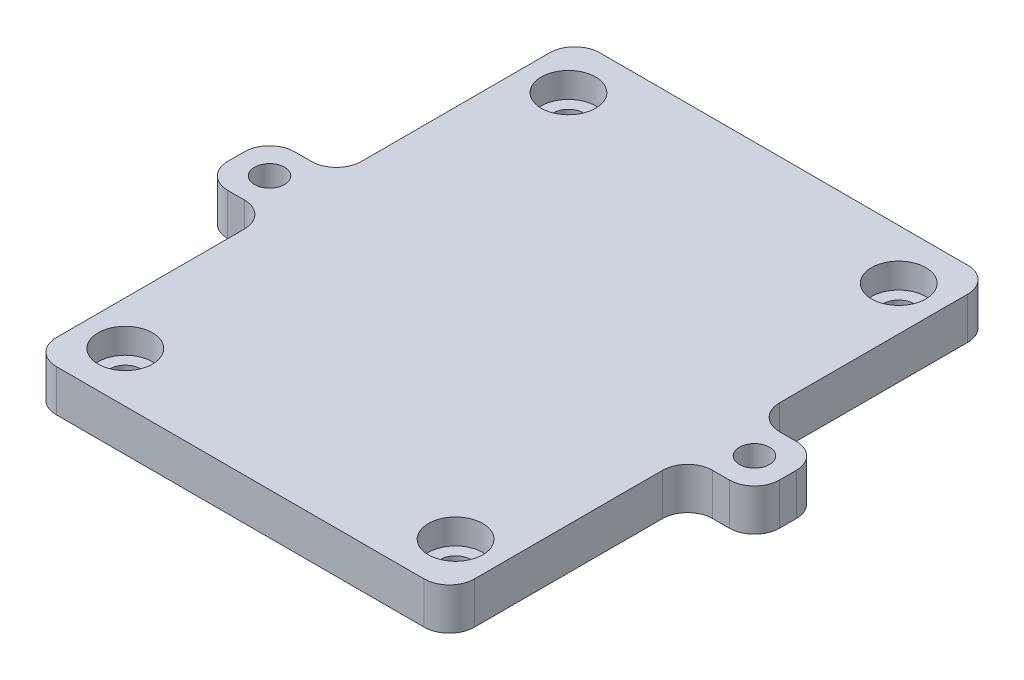
ISO-10303-21;
HEADER;
FILE_DESCRIPTION(('STEP AP214'),'2;1');
FILE_NAME('part.step','',(''),(''),'','','');
FILE_SCHEMA(('AUTOMOTIVE_DESIGN { 1 0 10303 214 1 1 1 1 }'));
ENDSEC;
DATA;
#1=APPLICATION_CONTEXT('core data for automotive mechanical design processes');
#2=APPLICATION_PROTOCOL_DEFINITION('international standard','automotive_design',2000,#1);
#3=PRODUCT_CONTEXT('',#1,'mechanical');
#4=PRODUCT('Part','Part','',(#3));
#5=PRODUCT_RELATED_PRODUCT_CATEGORY('part','',(#4));
#6=PRODUCT_DEFINITION_FORMATION('','',#4);
#7=PRODUCT_DEFINITION_CONTEXT('part definition',#1,'design');
#8=PRODUCT_DEFINITION('design','',#6,#7);
#9=PRODUCT_DEFINITION_SHAPE('','',#8);
#10=(LENGTH_UNIT() NAMED_UNIT(*) SI_UNIT(.MILLI.,.METRE.));
#11=(NAMED_UNIT(*) PLANE_ANGLE_UNIT() SI_UNIT($,.RADIAN.));
#12=(NAMED_UNIT(*) SI_UNIT($,.STERADIAN.) SOLID_ANGLE_UNIT());
#13=UNCERTAINTY_MEASURE_WITH_UNIT(LENGTH_MEASURE(1.E-05),#10,'distance_accuracy_value','');
#14=(GEOMETRIC_REPRESENTATION_CONTEXT(3) GLOBAL_UNCERTAINTY_ASSIGNED_CONTEXT((#13)) GLOBAL_UNIT_ASSIGNED_CONTEXT((#10,
#11,#12)) REPRESENTATION_CONTEXT('',''));
#15=CARTESIAN_POINT('',(0.,0.,0.));
#16=DIRECTION('',(0.,0.,1.));
#17=DIRECTION('',(1.,0.,0.));
#18=AXIS2_PLACEMENT_3D('',#15,#16,#17);
#19=CARTESIAN_POINT('',(0.,5.,0.));
#20=DIRECTION('',(0.,-1.,0.));
#21=DIRECTION('',(0.,0.,-1.));
#22=AXIS2_PLACEMENT_3D('',#19,#20,#21);
#23=PLANE('',#22);
#24=CARTESIAN_POINT('',(-29.,5.,0.));
#25=DIRECTION('',(0.,1.,0.));
#26=DIRECTION('',(0.,0.,1.));
#27=AXIS2_PLACEMENT_3D('',#24,#25,#26);
#28=CIRCLE('',#27,1.8);
#29=CARTESIAN_POINT('',(-29.,5.,1.8));
#30=VERTEX_POINT('',#29);
#31=EDGE_CURVE('E487',#30,#30,#28,.T.);
#32=ORIENTED_EDGE('',*,*,#31,.F.);
#33=EDGE_LOOP('',(#32));
#34=FACE_BOUND('',#33,.T.);
#35=CARTESIAN_POINT('',(19.75,5.,-26.5));
#36=DIRECTION('',(0.,1.,0.));
#37=DIRECTION('',(0.,0.,1.));
#38=AXIS2_PLACEMENT_3D('',#35,#36,#37);
#39=CIRCLE('',#38,3.25);
#40=CARTESIAN_POINT('',(19.75,5.,-23.25));
#41=VERTEX_POINT('',#40);
#42=EDGE_CURVE('E407',#41,#41,#39,.T.);
#43=ORIENTED_EDGE('',*,*,#42,.F.);
#44=EDGE_LOOP('',(#43));
#45=FACE_BOUND('',#44,.T.);
#46=CARTESIAN_POINT('',(-19.75,5.,-26.5));
#47=DIRECTION('',(0.,1.,0.));
#48=DIRECTION('',(0.,0.,1.));
#49=AXIS2_PLACEMENT_3D('',#46,#47,#48);
#50=CIRCLE('',#49,3.25);
#51=CARTESIAN_POINT('',(-19.75,5.,-23.25));
#52=VERTEX_POINT('',#51);
#53=EDGE_CURVE('E432',#52,#52,#50,.T.);
#54=ORIENTED_EDGE('',*,*,#53,.F.);
#55=EDGE_LOOP('',(#54));
#56=FACE_BOUND('',#55,.T.);
#57=DIRECTION('',(0.,0.,-1.));
#58=VECTOR('',#57,1.);
#59=CARTESIAN_POINT('',(25.,5.,32.5));
#60=LINE('',#59,#58);
#61=CARTESIAN_POINT('',(25.,5.,-7.));
#62=VERTEX_POINT('',#61);
#63=CARTESIAN_POINT('',(25.,5.,-29.5));
#64=VERTEX_POINT('',#63);
#65=EDGE_CURVE('E242',#62,#64,#60,.T.);
#66=ORIENTED_EDGE('',*,*,#65,.T.);
#67=CARTESIAN_POINT('',(22.,5.,-29.5));
#68=DIRECTION('',(0.,-1.,0.));
#69=DIRECTION('',(0.,0.,-1.));
#70=AXIS2_PLACEMENT_3D('',#67,#68,#69);
#71=CIRCLE('',#70,3.);
#72=CARTESIAN_POINT('',(22.,5.,-32.5));
#73=VERTEX_POINT('',#72);
#74=EDGE_CURVE('E273',#64,#73,#71,.F.);
#75=ORIENTED_EDGE('',*,*,#74,.T.);
#76=DIRECTION('',(-1.,0.,0.));
#77=VECTOR('',#76,1.);
#78=CARTESIAN_POINT('',(-25.,5.,-32.5));
#79=LINE('',#78,#77);
#80=CARTESIAN_POINT('',(-22.,5.,-32.5));
#81=VERTEX_POINT('',#80);
#82=EDGE_CURVE('E220',#73,#81,#79,.T.);
#83=ORIENTED_EDGE('',*,*,#82,.T.);
#84=CARTESIAN_POINT('',(-22.,5.,-29.5));
#85=DIRECTION('',(0.,-1.,0.));
#86=DIRECTION('',(0.,0.,-1.));
#87=AXIS2_PLACEMENT_3D('',#84,#85,#86);
#88=CIRCLE('',#87,3.);
#89=CARTESIAN_POINT('',(-25.,5.,-29.5));
#90=VERTEX_POINT('',#89);
#91=EDGE_CURVE('E271',#81,#90,#88,.F.);
#92=ORIENTED_EDGE('',*,*,#91,.T.);
#93=DIRECTION('',(0.,0.,1.));
#94=VECTOR('',#93,1.);
#95=CARTESIAN_POINT('',(-25.,5.,32.5));
#96=LINE('',#95,#94);
#97=CARTESIAN_POINT('',(-25.,5.,-7.));
#98=VERTEX_POINT('',#97);
#99=EDGE_CURVE('E342',#90,#98,#96,.T.);
#100=ORIENTED_EDGE('',*,*,#99,.T.);
#101=CARTESIAN_POINT('',(-28.,5.,-7.));
#102=DIRECTION('',(0.,-1.,0.));
#103=DIRECTION('',(0.,0.,-1.));
#104=AXIS2_PLACEMENT_3D('',#101,#102,#103);
#105=CIRCLE('',#104,3.);
#106=CARTESIAN_POINT('',(-28.,5.,-4.));
#107=VERTEX_POINT('',#106);
#108=EDGE_CURVE('E47',#98,#107,#105,.T.);
#109=ORIENTED_EDGE('',*,*,#108,.T.);
#110=DIRECTION('',(-1.,0.,0.));
#111=VECTOR('',#110,1.);
#112=CARTESIAN_POINT('',(-33.,5.,-4.));
#113=LINE('',#112,#111);
#114=CARTESIAN_POINT('',(-30.,5.,-4.));
#115=VERTEX_POINT('',#114);
#116=EDGE_CURVE('E340',#107,#115,#113,.T.);
#117=ORIENTED_EDGE('',*,*,#116,.T.);
#118=CARTESIAN_POINT('',(-30.,5.,-1.));
#119=DIRECTION('',(0.,-1.,0.));
#120=DIRECTION('',(0.,0.,-1.));
#121=AXIS2_PLACEMENT_3D('',#118,#119,#120);
#122=CIRCLE('',#121,3.);
#123=CARTESIAN_POINT('',(-33.,5.,-1.));
#124=VERTEX_POINT('',#123);
#125=EDGE_CURVE('E269',#115,#124,#122,.F.);
#126=ORIENTED_EDGE('',*,*,#125,.T.);
#127=DIRECTION('',(0.,0.,1.));
#128=VECTOR('',#127,1.);
#129=CARTESIAN_POINT('',(-33.,5.,4.));
#130=LINE('',#129,#128);
#131=CARTESIAN_POINT('',(-33.,5.,1.));
#132=VERTEX_POINT('',#131);
#133=EDGE_CURVE('E400',#124,#132,#130,.T.);
#134=ORIENTED_EDGE('',*,*,#133,.T.);
#135=CARTESIAN_POINT('',(-30.,5.,1.));
#136=DIRECTION('',(0.,-1.,0.));
#137=DIRECTION('',(0.,0.,-1.));
#138=AXIS2_PLACEMENT_3D('',#135,#136,#137);
#139=CIRCLE('',#138,3.);
#140=CARTESIAN_POINT('',(-30.,5.,4.));
#141=VERTEX_POINT('',#140);
#142=EDGE_CURVE('E267',#132,#141,#139,.F.);
#143=ORIENTED_EDGE('',*,*,#142,.T.);
#144=DIRECTION('',(1.,0.,0.));
#145=VECTOR('',#144,1.);
#146=CARTESIAN_POINT('',(-33.,5.,4.));
#147=LINE('',#146,#145);
#148=CARTESIAN_POINT('',(-28.,5.,4.));
#149=VERTEX_POINT('',#148);
#150=EDGE_CURVE('E399',#141,#149,#147,.T.);
#151=ORIENTED_EDGE('',*,*,#150,.T.);
#152=CARTESIAN_POINT('',(-28.,5.,7.));
#153=DIRECTION('',(0.,-1.,0.));
#154=DIRECTION('',(0.,0.,-1.));
#155=AXIS2_PLACEMENT_3D('',#152,#153,#154);
#156=CIRCLE('',#155,3.);
#157=CARTESIAN_POINT('',(-25.,5.,7.));
#158=VERTEX_POINT('',#157);
#159=EDGE_CURVE('E326',#149,#158,#156,.T.);
#160=ORIENTED_EDGE('',*,*,#159,.T.);
#161=CARTESIAN_POINT('',(-25.,5.,29.5));
#162=VERTEX_POINT('',#161);
#163=EDGE_CURVE('E362',#158,#162,#96,.T.);
#164=ORIENTED_EDGE('',*,*,#163,.T.);
#165=CARTESIAN_POINT('',(-22.,5.,29.5));
#166=DIRECTION('',(0.,-1.,0.));
#167=DIRECTION('',(0.,0.,-1.));
#168=AXIS2_PLACEMENT_3D('',#165,#166,#167);
#169=CIRCLE('',#168,3.);
#170=CARTESIAN_POINT('',(-22.,5.,32.5));
#171=VERTEX_POINT('',#170);
#172=EDGE_CURVE('E265',#162,#171,#169,.F.);
#173=ORIENTED_EDGE('',*,*,#172,.T.);
#174=DIRECTION('',(1.,0.,0.));
#175=VECTOR('',#174,1.);
#176=CARTESIAN_POINT('',(-25.,5.,32.5));
#177=LINE('',#176,#175);
#178=CARTESIAN_POINT('',(22.,5.,32.5));
#179=VERTEX_POINT('',#178);
#180=EDGE_CURVE('E243',#171,#179,#177,.T.);
#181=ORIENTED_EDGE('',*,*,#180,.T.);
#182=CARTESIAN_POINT('',(22.,5.,29.5));
#183=DIRECTION('',(0.,-1.,0.));
#184=DIRECTION('',(0.,0.,-1.));
#185=AXIS2_PLACEMENT_3D('',#182,#183,#184);
#186=CIRCLE('',#185,3.);
#187=CARTESIAN_POINT('',(25.,5.,29.5));
#188=VERTEX_POINT('',#187);
#189=EDGE_CURVE('E263',#179,#188,#186,.F.);
#190=ORIENTED_EDGE('',*,*,#189,.T.);
#191=CARTESIAN_POINT('',(25.,5.,7.));
#192=VERTEX_POINT('',#191);
#193=EDGE_CURVE('E363',#188,#192,#60,.T.);
#194=ORIENTED_EDGE('',*,*,#193,.T.);
#195=CARTESIAN_POINT('',(28.,5.,7.));
#196=DIRECTION('',(0.,-1.,0.));
#197=DIRECTION('',(0.,0.,-1.));
#198=AXIS2_PLACEMENT_3D('',#195,#196,#197);
#199=CIRCLE('',#198,3.);
#200=CARTESIAN_POINT('',(28.,5.,4.));
#201=VERTEX_POINT('',#200);
#202=EDGE_CURVE('E328',#192,#201,#199,.T.);
#203=ORIENTED_EDGE('',*,*,#202,.T.);
#204=CARTESIAN_POINT('',(30.,5.,4.));
#205=VERTEX_POINT('',#204);
#206=EDGE_CURVE('E395',#201,#205,#147,.T.);
#207=ORIENTED_EDGE('',*,*,#206,.T.);
#208=CARTESIAN_POINT('',(30.,5.,1.));
#209=DIRECTION('',(0.,-1.,0.));
#210=DIRECTION('',(0.,0.,-1.));
#211=AXIS2_PLACEMENT_3D('',#208,#209,#210);
#212=CIRCLE('',#211,3.);
#213=CARTESIAN_POINT('',(33.,5.,1.));
#214=VERTEX_POINT('',#213);
#215=EDGE_CURVE('E261',#205,#214,#212,.F.);
#216=ORIENTED_EDGE('',*,*,#215,.T.);
#217=DIRECTION('',(0.,0.,-1.));
#218=VECTOR('',#217,1.);
#219=CARTESIAN_POINT('',(33.,5.,4.));
#220=LINE('',#219,#218);
#221=CARTESIAN_POINT('',(33.,5.,-1.));
#222=VERTEX_POINT('',#221);
#223=EDGE_CURVE('E352',#214,#222,#220,.T.);
#224=ORIENTED_EDGE('',*,*,#223,.T.);
#225=CARTESIAN_POINT('',(30.,5.,-1.));
#226=DIRECTION('',(0.,-1.,0.));
#227=DIRECTION('',(0.,0.,-1.));
#228=AXIS2_PLACEMENT_3D('',#225,#226,#227);
#229=CIRCLE('',#228,3.);
#230=CARTESIAN_POINT('',(30.,5.,-4.));
#231=VERTEX_POINT('',#230);
#232=EDGE_CURVE('E61',#222,#231,#229,.F.);
#233=ORIENTED_EDGE('',*,*,#232,.T.);
#234=CARTESIAN_POINT('',(28.,5.,-4.));
#235=VERTEX_POINT('',#234);
#236=EDGE_CURVE('E351',#231,#235,#113,.T.);
#237=ORIENTED_EDGE('',*,*,#236,.T.);
#238=CARTESIAN_POINT('',(28.,5.,-7.));
#239=DIRECTION('',(0.,-1.,0.));
#240=DIRECTION('',(0.,0.,-1.));
#241=AXIS2_PLACEMENT_3D('',#238,#239,#240);
#242=CIRCLE('',#241,3.);
#243=EDGE_CURVE('E334',#235,#62,#242,.T.);
#244=ORIENTED_EDGE('',*,*,#243,.T.);
#245=EDGE_LOOP('',(#66,#75,#83,#92,#100,#109,#117,#126,#134,#143,#151,#160,#164,#173,#181,#190,
#194,#203,#207,#216,#224,#233,#237,#244));
#246=FACE_BOUND('',#245,.T.);
#247=CARTESIAN_POINT('',(19.75,5.,26.5));
#248=DIRECTION('',(0.,1.,0.));
#249=DIRECTION('',(0.,0.,1.));
#250=AXIS2_PLACEMENT_3D('',#247,#248,#249);
#251=CIRCLE('',#250,3.25);
#252=CARTESIAN_POINT('',(19.75,5.,29.75));
#253=VERTEX_POINT('',#252);
#254=EDGE_CURVE('E444',#253,#253,#251,.T.);
#255=ORIENTED_EDGE('',*,*,#254,.F.);
#256=EDGE_LOOP('',(#255));
#257=FACE_BOUND('',#256,.T.);
#258=CARTESIAN_POINT('',(-19.75,5.,26.5));
#259=DIRECTION('',(0.,1.,0.));
#260=DIRECTION('',(0.,0.,1.));
#261=AXIS2_PLACEMENT_3D('',#258,#259,#260);
#262=CIRCLE('',#261,3.25);
#263=CARTESIAN_POINT('',(-19.75,5.,29.75));
#264=VERTEX_POINT('',#263);
#265=EDGE_CURVE('E420',#264,#264,#262,.T.);
#266=ORIENTED_EDGE('',*,*,#265,.F.);
#267=EDGE_LOOP('',(#266));
#268=FACE_BOUND('',#267,.T.);
#269=CARTESIAN_POINT('',(29.,5.,0.));
#270=DIRECTION('',(0.,1.,0.));
#271=DIRECTION('',(0.,0.,1.));
#272=AXIS2_PLACEMENT_3D('',#269,#270,#271);
#273=CIRCLE('',#272,1.8);
#274=CARTESIAN_POINT('',(29.,5.,1.8));
#275=VERTEX_POINT('',#274);
#276=EDGE_CURVE('E481',#275,#275,#273,.T.);
#277=ORIENTED_EDGE('',*,*,#276,.F.);
#278=EDGE_LOOP('',(#277));
#279=FACE_BOUND('',#278,.T.);
#280=ADVANCED_FACE('F39',(#34,#45,#56,#246,#257,#268,#279),#23,.F.);
#281=CARTESIAN_POINT('',(0.,0.,0.));
#282=DIRECTION('',(0.,-1.,0.));
#283=DIRECTION('',(0.,0.,-1.));
#284=AXIS2_PLACEMENT_3D('',#281,#282,#283);
#285=PLANE('',#284);
#286=CARTESIAN_POINT('',(-29.,0.,0.));
#287=DIRECTION('',(0.,1.,0.));
#288=DIRECTION('',(0.,0.,1.));
#289=AXIS2_PLACEMENT_3D('',#286,#287,#288);
#290=CIRCLE('',#289,1.8);
#291=CARTESIAN_POINT('',(-29.,0.,1.8));
#292=VERTEX_POINT('',#291);
#293=EDGE_CURVE('E484',#292,#292,#290,.T.);
#294=ORIENTED_EDGE('',*,*,#293,.T.);
#295=EDGE_LOOP('',(#294));
#296=FACE_BOUND('',#295,.T.);
#297=CARTESIAN_POINT('',(-19.75,0.,26.5));
#298=DIRECTION('',(0.,1.,0.));
#299=DIRECTION('',(0.,0.,1.));
#300=AXIS2_PLACEMENT_3D('',#297,#298,#299);
#301=CIRCLE('',#300,1.8);
#302=CARTESIAN_POINT('',(-19.75,0.,28.3));
#303=VERTEX_POINT('',#302);
#304=EDGE_CURVE('E429',#303,#303,#301,.T.);
#305=ORIENTED_EDGE('',*,*,#304,.T.);
#306=EDGE_LOOP('',(#305));
#307=FACE_BOUND('',#306,.T.);
#308=CARTESIAN_POINT('',(19.75,0.,26.5));
#309=DIRECTION('',(0.,1.,0.));
#310=DIRECTION('',(0.,0.,1.));
#311=AXIS2_PLACEMENT_3D('',#308,#309,#310);
#312=CIRCLE('',#311,1.8);
#313=CARTESIAN_POINT('',(19.75,0.,28.3));
#314=VERTEX_POINT('',#313);
#315=EDGE_CURVE('E452',#314,#314,#312,.T.);
#316=ORIENTED_EDGE('',*,*,#315,.T.);
#317=EDGE_LOOP('',(#316));
#318=FACE_BOUND('',#317,.T.);
#319=CARTESIAN_POINT('',(-19.75,0.,-26.5));
#320=DIRECTION('',(0.,1.,0.));
#321=DIRECTION('',(0.,0.,1.));
#322=AXIS2_PLACEMENT_3D('',#319,#320,#321);
#323=CIRCLE('',#322,1.8);
#324=CARTESIAN_POINT('',(-19.75,0.,-24.7));
#325=VERTEX_POINT('',#324);
#326=EDGE_CURVE('E441',#325,#325,#323,.T.);
#327=ORIENTED_EDGE('',*,*,#326,.T.);
#328=EDGE_LOOP('',(#327));
#329=FACE_BOUND('',#328,.T.);
#330=CARTESIAN_POINT('',(19.75,0.,-26.5));
#331=DIRECTION('',(0.,1.,0.));
#332=DIRECTION('',(0.,0.,1.));
#333=AXIS2_PLACEMENT_3D('',#330,#331,#332);
#334=CIRCLE('',#333,1.8);
#335=CARTESIAN_POINT('',(19.75,0.,-24.7));
#336=VERTEX_POINT('',#335);
#337=EDGE_CURVE('E417',#336,#336,#334,.T.);
#338=ORIENTED_EDGE('',*,*,#337,.T.);
#339=EDGE_LOOP('',(#338));
#340=FACE_BOUND('',#339,.T.);
#341=DIRECTION('',(-1.,0.,0.));
#342=VECTOR('',#341,1.);
#343=CARTESIAN_POINT('',(-25.,0.,-32.5));
#344=LINE('',#343,#342);
#345=CARTESIAN_POINT('',(22.,0.,-32.5));
#346=VERTEX_POINT('',#345);
#347=CARTESIAN_POINT('',(-22.,0.,-32.5));
#348=VERTEX_POINT('',#347);
#349=EDGE_CURVE('E217',#346,#348,#344,.T.);
#350=ORIENTED_EDGE('',*,*,#349,.F.);
#351=CARTESIAN_POINT('',(22.,0.,-29.5));
#352=DIRECTION('',(0.,-1.,0.));
#353=DIRECTION('',(0.,0.,-1.));
#354=AXIS2_PLACEMENT_3D('',#351,#352,#353);
#355=CIRCLE('',#354,3.);
#356=CARTESIAN_POINT('',(25.,0.,-29.5));
#357=VERTEX_POINT('',#356);
#358=EDGE_CURVE('E200',#346,#357,#355,.T.);
#359=ORIENTED_EDGE('',*,*,#358,.T.);
#360=DIRECTION('',(0.,0.,-1.));
#361=VECTOR('',#360,1.);
#362=CARTESIAN_POINT('',(25.,0.,32.5));
#363=LINE('',#362,#361);
#364=CARTESIAN_POINT('',(25.,0.,-7.));
#365=VERTEX_POINT('',#364);
#366=EDGE_CURVE('E234',#365,#357,#363,.T.);
#367=ORIENTED_EDGE('',*,*,#366,.F.);
#368=CARTESIAN_POINT('',(28.,0.,-7.));
#369=DIRECTION('',(0.,-1.,0.));
#370=DIRECTION('',(0.,0.,-1.));
#371=AXIS2_PLACEMENT_3D('',#368,#369,#370);
#372=CIRCLE('',#371,3.);
#373=CARTESIAN_POINT('',(28.,0.,-4.));
#374=VERTEX_POINT('',#373);
#375=EDGE_CURVE('E332',#365,#374,#372,.F.);
#376=ORIENTED_EDGE('',*,*,#375,.T.);
#377=DIRECTION('',(-1.,0.,0.));
#378=VECTOR('',#377,1.);
#379=CARTESIAN_POINT('',(-33.,0.,-4.));
#380=LINE('',#379,#378);
#381=CARTESIAN_POINT('',(30.,0.,-4.));
#382=VERTEX_POINT('',#381);
#383=EDGE_CURVE('E461',#382,#374,#380,.T.);
#384=ORIENTED_EDGE('',*,*,#383,.F.);
#385=CARTESIAN_POINT('',(30.,0.,-1.));
#386=DIRECTION('',(0.,-1.,0.));
#387=DIRECTION('',(0.,0.,-1.));
#388=AXIS2_PLACEMENT_3D('',#385,#386,#387);
#389=CIRCLE('',#388,3.);
#390=CARTESIAN_POINT('',(33.,0.,-1.));
#391=VERTEX_POINT('',#390);
#392=EDGE_CURVE('E221',#382,#391,#389,.T.);
#393=ORIENTED_EDGE('',*,*,#392,.T.);
#394=DIRECTION('',(0.,0.,-1.));
#395=VECTOR('',#394,1.);
#396=CARTESIAN_POINT('',(33.,0.,4.));
#397=LINE('',#396,#395);
#398=CARTESIAN_POINT('',(33.,0.,1.));
#399=VERTEX_POINT('',#398);
#400=EDGE_CURVE('E403',#399,#391,#397,.T.);
#401=ORIENTED_EDGE('',*,*,#400,.F.);
#402=CARTESIAN_POINT('',(30.,0.,1.));
#403=DIRECTION('',(0.,-1.,0.));
#404=DIRECTION('',(0.,0.,-1.));
#405=AXIS2_PLACEMENT_3D('',#402,#403,#404);
#406=CIRCLE('',#405,3.);
#407=CARTESIAN_POINT('',(30.,0.,4.));
#408=VERTEX_POINT('',#407);
#409=EDGE_CURVE('E246',#399,#408,#406,.T.);
#410=ORIENTED_EDGE('',*,*,#409,.T.);
#411=DIRECTION('',(1.,0.,0.));
#412=VECTOR('',#411,1.);
#413=CARTESIAN_POINT('',(-33.,0.,4.));
#414=LINE('',#413,#412);
#415=CARTESIAN_POINT('',(28.,0.,4.));
#416=VERTEX_POINT('',#415);
#417=EDGE_CURVE('E389',#416,#408,#414,.T.);
#418=ORIENTED_EDGE('',*,*,#417,.F.);
#419=CARTESIAN_POINT('',(28.,0.,7.));
#420=DIRECTION('',(0.,-1.,0.));
#421=DIRECTION('',(0.,0.,-1.));
#422=AXIS2_PLACEMENT_3D('',#419,#420,#421);
#423=CIRCLE('',#422,3.);
#424=CARTESIAN_POINT('',(25.,0.,7.));
#425=VERTEX_POINT('',#424);
#426=EDGE_CURVE('E330',#416,#425,#423,.F.);
#427=ORIENTED_EDGE('',*,*,#426,.T.);
#428=CARTESIAN_POINT('',(25.,0.,29.5));
#429=VERTEX_POINT('',#428);
#430=EDGE_CURVE('E228',#429,#425,#363,.T.);
#431=ORIENTED_EDGE('',*,*,#430,.F.);
#432=CARTESIAN_POINT('',(22.,0.,29.5));
#433=DIRECTION('',(0.,-1.,0.));
#434=DIRECTION('',(0.,0.,-1.));
#435=AXIS2_PLACEMENT_3D('',#432,#433,#434);
#436=CIRCLE('',#435,3.);
#437=CARTESIAN_POINT('',(22.,0.,32.5));
#438=VERTEX_POINT('',#437);
#439=EDGE_CURVE('E248',#429,#438,#436,.T.);
#440=ORIENTED_EDGE('',*,*,#439,.T.);
#441=DIRECTION('',(1.,0.,0.));
#442=VECTOR('',#441,1.);
#443=CARTESIAN_POINT('',(-25.,0.,32.5));
#444=LINE('',#443,#442);
#445=CARTESIAN_POINT('',(-22.,0.,32.5));
#446=VERTEX_POINT('',#445);
#447=EDGE_CURVE('E239',#446,#438,#444,.T.);
#448=ORIENTED_EDGE('',*,*,#447,.F.);
#449=CARTESIAN_POINT('',(-22.,0.,29.5));
#450=DIRECTION('',(0.,-1.,0.));
#451=DIRECTION('',(0.,0.,-1.));
#452=AXIS2_PLACEMENT_3D('',#449,#450,#451);
#453=CIRCLE('',#452,3.);
#454=CARTESIAN_POINT('',(-25.,0.,29.5));
#455=VERTEX_POINT('',#454);
#456=EDGE_CURVE('E250',#446,#455,#453,.T.);
#457=ORIENTED_EDGE('',*,*,#456,.T.);
#458=DIRECTION('',(0.,0.,1.));
#459=VECTOR('',#458,1.);
#460=CARTESIAN_POINT('',(-25.,0.,32.5));
#461=LINE('',#460,#459);
#462=CARTESIAN_POINT('',(-25.,0.,7.));
#463=VERTEX_POINT('',#462);
#464=EDGE_CURVE('E227',#463,#455,#461,.T.);
#465=ORIENTED_EDGE('',*,*,#464,.F.);
#466=CARTESIAN_POINT('',(-28.,0.,7.));
#467=DIRECTION('',(0.,-1.,0.));
#468=DIRECTION('',(0.,0.,-1.));
#469=AXIS2_PLACEMENT_3D('',#466,#467,#468);
#470=CIRCLE('',#469,3.);
#471=CARTESIAN_POINT('',(-28.,0.,4.));
#472=VERTEX_POINT('',#471);
#473=EDGE_CURVE('E324',#463,#472,#470,.F.);
#474=ORIENTED_EDGE('',*,*,#473,.T.);
#475=CARTESIAN_POINT('',(-30.,0.,4.));
#476=VERTEX_POINT('',#475);
#477=EDGE_CURVE('E411',#476,#472,#414,.T.);
#478=ORIENTED_EDGE('',*,*,#477,.F.);
#479=CARTESIAN_POINT('',(-30.,0.,1.));
#480=DIRECTION('',(0.,-1.,0.));
#481=DIRECTION('',(0.,0.,-1.));
#482=AXIS2_PLACEMENT_3D('',#479,#480,#481);
#483=CIRCLE('',#482,3.);
#484=CARTESIAN_POINT('',(-33.,0.,1.));
#485=VERTEX_POINT('',#484);
#486=EDGE_CURVE('E252',#476,#485,#483,.T.);
#487=ORIENTED_EDGE('',*,*,#486,.T.);
#488=DIRECTION('',(0.,0.,1.));
#489=VECTOR('',#488,1.);
#490=CARTESIAN_POINT('',(-33.,0.,4.));
#491=LINE('',#490,#489);
#492=CARTESIAN_POINT('',(-33.,0.,-1.));
#493=VERTEX_POINT('',#492);
#494=EDGE_CURVE('E466',#493,#485,#491,.T.);
#495=ORIENTED_EDGE('',*,*,#494,.F.);
#496=CARTESIAN_POINT('',(-30.,0.,-1.));
#497=DIRECTION('',(0.,-1.,0.));
#498=DIRECTION('',(0.,0.,-1.));
#499=AXIS2_PLACEMENT_3D('',#496,#497,#498);
#500=CIRCLE('',#499,3.);
#501=CARTESIAN_POINT('',(-30.,0.,-4.));
#502=VERTEX_POINT('',#501);
#503=EDGE_CURVE('E254',#493,#502,#500,.T.);
#504=ORIENTED_EDGE('',*,*,#503,.T.);
#505=CARTESIAN_POINT('',(-28.,0.,-4.));
#506=VERTEX_POINT('',#505);
#507=EDGE_CURVE('E355',#506,#502,#380,.T.);
#508=ORIENTED_EDGE('',*,*,#507,.F.);
#509=CARTESIAN_POINT('',(-28.,0.,-7.));
#510=DIRECTION('',(0.,-1.,0.));
#511=DIRECTION('',(0.,0.,-1.));
#512=AXIS2_PLACEMENT_3D('',#509,#510,#511);
#513=CIRCLE('',#512,3.);
#514=CARTESIAN_POINT('',(-25.,0.,-7.));
#515=VERTEX_POINT('',#514);
#516=EDGE_CURVE('E11',#506,#515,#513,.F.);
#517=ORIENTED_EDGE('',*,*,#516,.T.);
#518=CARTESIAN_POINT('',(-25.,0.,-29.5));
#519=VERTEX_POINT('',#518);
#520=EDGE_CURVE('E231',#519,#515,#461,.T.);
#521=ORIENTED_EDGE('',*,*,#520,.F.);
#522=CARTESIAN_POINT('',(-22.,0.,-29.5));
#523=DIRECTION('',(0.,-1.,0.));
#524=DIRECTION('',(0.,0.,-1.));
#525=AXIS2_PLACEMENT_3D('',#522,#523,#524);
#526=CIRCLE('',#525,3.);
#527=EDGE_CURVE('E211',#519,#348,#526,.T.);
#528=ORIENTED_EDGE('',*,*,#527,.T.);
#529=EDGE_LOOP('',(#350,#359,#367,#376,#384,#393,#401,#410,#418,#427,#431,#440,#448,#457,#465,
#474,#478,#487,#495,#504,#508,#517,#521,#528));
#530=FACE_BOUND('',#529,.T.);
#531=CARTESIAN_POINT('',(29.,0.,0.));
#532=DIRECTION('',(0.,1.,0.));
#533=DIRECTION('',(0.,0.,1.));
#534=AXIS2_PLACEMENT_3D('',#531,#532,#533);
#535=CIRCLE('',#534,1.8);
#536=CARTESIAN_POINT('',(29.,0.,1.8));
#537=VERTEX_POINT('',#536);
#538=EDGE_CURVE('E472',#537,#537,#535,.T.);
#539=ORIENTED_EDGE('',*,*,#538,.T.);
#540=EDGE_LOOP('',(#539));
#541=FACE_BOUND('',#540,.T.);
#542=ADVANCED_FACE('F224',(#296,#307,#318,#329,#340,#530,#541),#285,.T.);
#543=CARTESIAN_POINT('',(25.,5.,32.5));
#544=DIRECTION('',(-1.,0.,0.));
#545=DIRECTION('',(0.,0.,1.));
#546=AXIS2_PLACEMENT_3D('',#543,#544,#545);
#547=PLANE('',#546);
#548=ORIENTED_EDGE('',*,*,#193,.F.);
#549=DIRECTION('',(0.,-1.,0.));
#550=VECTOR('',#549,1.);
#551=CARTESIAN_POINT('',(25.,5.,29.5));
#552=LINE('',#551,#550);
#553=EDGE_CURVE('E308',#188,#429,#552,.T.);
#554=ORIENTED_EDGE('',*,*,#553,.T.);
#555=ORIENTED_EDGE('',*,*,#430,.T.);
#556=DIRECTION('',(0.,1.,0.));
#557=VECTOR('',#556,1.);
#558=CARTESIAN_POINT('',(25.,5.,7.));
#559=LINE('',#558,#557);
#560=EDGE_CURVE('E305',#425,#192,#559,.T.);
#561=ORIENTED_EDGE('',*,*,#560,.T.);
#562=EDGE_LOOP('',(#548,#554,#555,#561));
#563=FACE_BOUND('',#562,.T.);
#564=ADVANCED_FACE('F383',(#563),#547,.F.);
#565=CARTESIAN_POINT('',(-25.,5.,32.5));
#566=DIRECTION('',(1.,0.,0.));
#567=DIRECTION('',(0.,0.,-1.));
#568=AXIS2_PLACEMENT_3D('',#565,#566,#567);
#569=PLANE('',#568);
#570=ORIENTED_EDGE('',*,*,#163,.F.);
#571=DIRECTION('',(0.,-1.,0.));
#572=VECTOR('',#571,1.);
#573=CARTESIAN_POINT('',(-25.,5.,7.));
#574=LINE('',#573,#572);
#575=EDGE_CURVE('E297',#158,#463,#574,.T.);
#576=ORIENTED_EDGE('',*,*,#575,.T.);
#577=ORIENTED_EDGE('',*,*,#464,.T.);
#578=DIRECTION('',(0.,-1.,0.));
#579=VECTOR('',#578,1.);
#580=CARTESIAN_POINT('',(-25.,5.,29.5));
#581=LINE('',#580,#579);
#582=EDGE_CURVE('E295',#455,#162,#581,.F.);
#583=ORIENTED_EDGE('',*,*,#582,.T.);
#584=EDGE_LOOP('',(#570,#576,#577,#583));
#585=FACE_BOUND('',#584,.T.);
#586=ADVANCED_FACE('F542',(#585),#569,.F.);
#587=ORIENTED_EDGE('',*,*,#366,.T.);
#588=DIRECTION('',(0.,-1.,0.));
#589=VECTOR('',#588,1.);
#590=CARTESIAN_POINT('',(25.,5.,-29.5));
#591=LINE('',#590,#589);
#592=EDGE_CURVE('E205',#357,#64,#591,.F.);
#593=ORIENTED_EDGE('',*,*,#592,.T.);
#594=ORIENTED_EDGE('',*,*,#65,.F.);
#595=DIRECTION('',(0.,-1.,0.));
#596=VECTOR('',#595,1.);
#597=CARTESIAN_POINT('',(25.,5.,-7.));
#598=LINE('',#597,#596);
#599=EDGE_CURVE('E210',#62,#365,#598,.T.);
#600=ORIENTED_EDGE('',*,*,#599,.T.);
#601=EDGE_LOOP('',(#587,#593,#594,#600));
#602=FACE_BOUND('',#601,.T.);
#603=ADVANCED_FACE('F457',(#602),#547,.F.);
#604=CARTESIAN_POINT('',(-25.,5.,-32.5));
#605=DIRECTION('',(0.,0.,1.));
#606=DIRECTION('',(1.,0.,0.));
#607=AXIS2_PLACEMENT_3D('',#604,#605,#606);
#608=PLANE('',#607);
#609=ORIENTED_EDGE('',*,*,#82,.F.);
#610=DIRECTION('',(0.,-1.,0.));
#611=VECTOR('',#610,1.);
#612=CARTESIAN_POINT('',(22.,5.,-32.5));
#613=LINE('',#612,#611);
#614=EDGE_CURVE('E204',#73,#346,#613,.T.);
#615=ORIENTED_EDGE('',*,*,#614,.T.);
#616=ORIENTED_EDGE('',*,*,#349,.T.);
#617=DIRECTION('',(0.,-1.,0.));
#618=VECTOR('',#617,1.);
#619=CARTESIAN_POINT('',(-22.,5.,-32.5));
#620=LINE('',#619,#618);
#621=EDGE_CURVE('E222',#348,#81,#620,.F.);
#622=ORIENTED_EDGE('',*,*,#621,.T.);
#623=EDGE_LOOP('',(#609,#615,#616,#622));
#624=FACE_BOUND('',#623,.T.);
#625=ADVANCED_FACE('F216',(#624),#608,.F.);
#626=ORIENTED_EDGE('',*,*,#99,.F.);
#627=DIRECTION('',(0.,-1.,0.));
#628=VECTOR('',#627,1.);
#629=CARTESIAN_POINT('',(-25.,5.,-29.5));
#630=LINE('',#629,#628);
#631=EDGE_CURVE('E278',#90,#519,#630,.T.);
#632=ORIENTED_EDGE('',*,*,#631,.T.);
#633=ORIENTED_EDGE('',*,*,#520,.T.);
#634=DIRECTION('',(0.,1.,0.));
#635=VECTOR('',#634,1.);
#636=CARTESIAN_POINT('',(-25.,5.,-7.));
#637=LINE('',#636,#635);
#638=EDGE_CURVE('E275',#515,#98,#637,.T.);
#639=ORIENTED_EDGE('',*,*,#638,.T.);
#640=EDGE_LOOP('',(#626,#632,#633,#639));
#641=FACE_BOUND('',#640,.T.);
#642=ADVANCED_FACE('F357',(#641),#569,.F.);
#643=CARTESIAN_POINT('',(-25.,5.,32.5));
#644=DIRECTION('',(0.,0.,-1.));
#645=DIRECTION('',(-1.,0.,0.));
#646=AXIS2_PLACEMENT_3D('',#643,#644,#645);
#647=PLANE('',#646);
#648=ORIENTED_EDGE('',*,*,#180,.F.);
#649=DIRECTION('',(0.,-1.,0.));
#650=VECTOR('',#649,1.);
#651=CARTESIAN_POINT('',(-22.,5.,32.5));
#652=LINE('',#651,#650);
#653=EDGE_CURVE('E302',#171,#446,#652,.T.);
#654=ORIENTED_EDGE('',*,*,#653,.T.);
#655=ORIENTED_EDGE('',*,*,#447,.T.);
#656=DIRECTION('',(0.,-1.,0.));
#657=VECTOR('',#656,1.);
#658=CARTESIAN_POINT('',(22.,5.,32.5));
#659=LINE('',#658,#657);
#660=EDGE_CURVE('E300',#438,#179,#659,.F.);
#661=ORIENTED_EDGE('',*,*,#660,.T.);
#662=EDGE_LOOP('',(#648,#654,#655,#661));
#663=FACE_BOUND('',#662,.T.);
#664=ADVANCED_FACE('F532',(#663),#647,.F.);
#665=CARTESIAN_POINT('',(19.75,5.,26.5));
#666=DIRECTION('',(0.,1.,0.));
#667=DIRECTION('',(0.,0.,1.));
#668=AXIS2_PLACEMENT_3D('',#665,#666,#667);
#669=CYLINDRICAL_SURFACE('',#668,1.8);
#670=ORIENTED_EDGE('',*,*,#315,.F.);
#671=EDGE_LOOP('',(#670));
#672=FACE_BOUND('',#671,.T.);
#673=CARTESIAN_POINT('',(19.75,2.,26.5));
#674=DIRECTION('',(0.,1.,0.));
#675=DIRECTION('',(0.,0.,1.));
#676=AXIS2_PLACEMENT_3D('',#673,#674,#675);
#677=CIRCLE('',#676,1.8);
#678=CARTESIAN_POINT('',(19.75,2.,28.3));
#679=VERTEX_POINT('',#678);
#680=EDGE_CURVE('E450',#679,#679,#677,.T.);
#681=ORIENTED_EDGE('',*,*,#680,.T.);
#682=EDGE_LOOP('',(#681));
#683=FACE_BOUND('',#682,.T.);
#684=ADVANCED_FACE('F529',(#672,#683),#669,.F.);
#685=CARTESIAN_POINT('',(21.55,2.,26.5));
#686=DIRECTION('',(0.,-1.,0.));
#687=DIRECTION('',(0.,0.,-1.));
#688=AXIS2_PLACEMENT_3D('',#685,#686,#687);
#689=PLANE('',#688);
#690=ORIENTED_EDGE('',*,*,#680,.F.);
#691=EDGE_LOOP('',(#690));
#692=FACE_BOUND('',#691,.T.);
#693=CARTESIAN_POINT('',(19.75,2.,26.5));
#694=DIRECTION('',(0.,1.,0.));
#695=DIRECTION('',(0.,0.,1.));
#696=AXIS2_PLACEMENT_3D('',#693,#694,#695);
#697=CIRCLE('',#696,3.25);
#698=CARTESIAN_POINT('',(19.75,2.,29.75));
#699=VERTEX_POINT('',#698);
#700=EDGE_CURVE('E447',#699,#699,#697,.T.);
#701=ORIENTED_EDGE('',*,*,#700,.T.);
#702=EDGE_LOOP('',(#701));
#703=FACE_BOUND('',#702,.T.);
#704=ADVANCED_FACE('F525',(#692,#703),#689,.F.);
#705=CARTESIAN_POINT('',(19.75,5.,26.5));
#706=DIRECTION('',(0.,1.,0.));
#707=DIRECTION('',(0.,0.,1.));
#708=AXIS2_PLACEMENT_3D('',#705,#706,#707);
#709=CYLINDRICAL_SURFACE('',#708,3.25);
#710=ORIENTED_EDGE('',*,*,#700,.F.);
#711=EDGE_LOOP('',(#710));
#712=FACE_BOUND('',#711,.T.);
#713=ORIENTED_EDGE('',*,*,#254,.T.);
#714=EDGE_LOOP('',(#713));
#715=FACE_BOUND('',#714,.T.);
#716=ADVANCED_FACE('F521',(#712,#715),#709,.F.);
#717=CARTESIAN_POINT('',(-19.75,5.,-26.5));
#718=DIRECTION('',(0.,1.,0.));
#719=DIRECTION('',(0.,0.,1.));
#720=AXIS2_PLACEMENT_3D('',#717,#718,#719);
#721=CYLINDRICAL_SURFACE('',#720,1.8);
#722=ORIENTED_EDGE('',*,*,#326,.F.);
#723=EDGE_LOOP('',(#722));
#724=FACE_BOUND('',#723,.T.);
#725=CARTESIAN_POINT('',(-19.75,2.,-26.5));
#726=DIRECTION('',(0.,1.,0.));
#727=DIRECTION('',(0.,0.,1.));
#728=AXIS2_PLACEMENT_3D('',#725,#726,#727);
#729=CIRCLE('',#728,1.8);
#730=CARTESIAN_POINT('',(-19.75,2.,-24.7));
#731=VERTEX_POINT('',#730);
#732=EDGE_CURVE('E438',#731,#731,#729,.T.);
#733=ORIENTED_EDGE('',*,*,#732,.T.);
#734=EDGE_LOOP('',(#733));
#735=FACE_BOUND('',#734,.T.);
#736=ADVANCED_FACE('F513',(#724,#735),#721,.F.);
#737=CARTESIAN_POINT('',(-17.95,2.,-26.5));
#738=DIRECTION('',(0.,-1.,0.));
#739=DIRECTION('',(0.,0.,-1.));
#740=AXIS2_PLACEMENT_3D('',#737,#738,#739);
#741=PLANE('',#740);
#742=ORIENTED_EDGE('',*,*,#732,.F.);
#743=EDGE_LOOP('',(#742));
#744=FACE_BOUND('',#743,.T.);
#745=CARTESIAN_POINT('',(-19.75,2.,-26.5));
#746=DIRECTION('',(0.,1.,0.));
#747=DIRECTION('',(0.,0.,1.));
#748=AXIS2_PLACEMENT_3D('',#745,#746,#747);
#749=CIRCLE('',#748,3.25);
#750=CARTESIAN_POINT('',(-19.75,2.,-23.25));
#751=VERTEX_POINT('',#750);
#752=EDGE_CURVE('E435',#751,#751,#749,.T.);
#753=ORIENTED_EDGE('',*,*,#752,.T.);
#754=EDGE_LOOP('',(#753));
#755=FACE_BOUND('',#754,.T.);
#756=ADVANCED_FACE('F503',(#744,#755),#741,.F.);
#757=CARTESIAN_POINT('',(-19.75,5.,-26.5));
#758=DIRECTION('',(0.,1.,0.));
#759=DIRECTION('',(0.,0.,1.));
#760=AXIS2_PLACEMENT_3D('',#757,#758,#759);
#761=CYLINDRICAL_SURFACE('',#760,3.25);
#762=ORIENTED_EDGE('',*,*,#752,.F.);
#763=EDGE_LOOP('',(#762));
#764=FACE_BOUND('',#763,.T.);
#765=ORIENTED_EDGE('',*,*,#53,.T.);
#766=EDGE_LOOP('',(#765));
#767=FACE_BOUND('',#766,.T.);
#768=ADVANCED_FACE('F500',(#764,#767),#761,.F.);
#769=CARTESIAN_POINT('',(-19.75,5.,26.5));
#770=DIRECTION('',(0.,1.,0.));
#771=DIRECTION('',(0.,0.,1.));
#772=AXIS2_PLACEMENT_3D('',#769,#770,#771);
#773=CYLINDRICAL_SURFACE('',#772,1.8);
#774=ORIENTED_EDGE('',*,*,#304,.F.);
#775=EDGE_LOOP('',(#774));
#776=FACE_BOUND('',#775,.T.);
#777=CARTESIAN_POINT('',(-19.75,2.,26.5));
#778=DIRECTION('',(0.,1.,0.));
#779=DIRECTION('',(0.,0.,1.));
#780=AXIS2_PLACEMENT_3D('',#777,#778,#779);
#781=CIRCLE('',#780,1.8);
#782=CARTESIAN_POINT('',(-19.75,2.,28.3));
#783=VERTEX_POINT('',#782);
#784=EDGE_CURVE('E426',#783,#783,#781,.T.);
#785=ORIENTED_EDGE('',*,*,#784,.T.);
#786=EDGE_LOOP('',(#785));
#787=FACE_BOUND('',#786,.T.);
#788=ADVANCED_FACE('F502',(#776,#787),#773,.F.);
#789=CARTESIAN_POINT('',(-17.95,2.,26.5));
#790=DIRECTION('',(0.,-1.,0.));
#791=DIRECTION('',(0.,0.,-1.));
#792=AXIS2_PLACEMENT_3D('',#789,#790,#791);
#793=PLANE('',#792);
#794=ORIENTED_EDGE('',*,*,#784,.F.);
#795=EDGE_LOOP('',(#794));
#796=FACE_BOUND('',#795,.T.);
#797=CARTESIAN_POINT('',(-19.75,2.,26.5));
#798=DIRECTION('',(0.,1.,0.));
#799=DIRECTION('',(0.,0.,1.));
#800=AXIS2_PLACEMENT_3D('',#797,#798,#799);
#801=CIRCLE('',#800,3.25);
#802=CARTESIAN_POINT('',(-19.75,2.,29.75));
#803=VERTEX_POINT('',#802);
#804=EDGE_CURVE('E423',#803,#803,#801,.T.);
#805=ORIENTED_EDGE('',*,*,#804,.T.);
#806=EDGE_LOOP('',(#805));
#807=FACE_BOUND('',#806,.T.);
#808=ADVANCED_FACE('F510',(#796,#807),#793,.F.);
#809=CARTESIAN_POINT('',(-19.75,5.,26.5));
#810=DIRECTION('',(0.,1.,0.));
#811=DIRECTION('',(0.,0.,1.));
#812=AXIS2_PLACEMENT_3D('',#809,#810,#811);
#813=CYLINDRICAL_SURFACE('',#812,3.25);
#814=ORIENTED_EDGE('',*,*,#804,.F.);
#815=EDGE_LOOP('',(#814));
#816=FACE_BOUND('',#815,.T.);
#817=ORIENTED_EDGE('',*,*,#265,.T.);
#818=EDGE_LOOP('',(#817));
#819=FACE_BOUND('',#818,.T.);
#820=ADVANCED_FACE('F620',(#816,#819),#813,.F.);
#821=CARTESIAN_POINT('',(19.75,5.,-26.5));
#822=DIRECTION('',(0.,1.,0.));
#823=DIRECTION('',(0.,0.,1.));
#824=AXIS2_PLACEMENT_3D('',#821,#822,#823);
#825=CYLINDRICAL_SURFACE('',#824,1.8);
#826=ORIENTED_EDGE('',*,*,#337,.F.);
#827=EDGE_LOOP('',(#826));
#828=FACE_BOUND('',#827,.T.);
#829=CARTESIAN_POINT('',(19.75,2.,-26.5));
#830=DIRECTION('',(0.,1.,0.));
#831=DIRECTION('',(0.,0.,1.));
#832=AXIS2_PLACEMENT_3D('',#829,#830,#831);
#833=CIRCLE('',#832,1.8);
#834=CARTESIAN_POINT('',(19.75,2.,-24.7));
#835=VERTEX_POINT('',#834);
#836=EDGE_CURVE('E414',#835,#835,#833,.T.);
#837=ORIENTED_EDGE('',*,*,#836,.T.);
#838=EDGE_LOOP('',(#837));
#839=FACE_BOUND('',#838,.T.);
#840=ADVANCED_FACE('F616',(#828,#839),#825,.F.);
#841=CARTESIAN_POINT('',(21.55,2.,-26.5));
#842=DIRECTION('',(0.,-1.,0.));
#843=DIRECTION('',(0.,0.,-1.));
#844=AXIS2_PLACEMENT_3D('',#841,#842,#843);
#845=PLANE('',#844);
#846=ORIENTED_EDGE('',*,*,#836,.F.);
#847=EDGE_LOOP('',(#846));
#848=FACE_BOUND('',#847,.T.);
#849=CARTESIAN_POINT('',(19.75,2.,-26.5));
#850=DIRECTION('',(0.,1.,0.));
#851=DIRECTION('',(0.,0.,1.));
#852=AXIS2_PLACEMENT_3D('',#849,#850,#851);
#853=CIRCLE('',#852,3.25);
#854=CARTESIAN_POINT('',(19.75,2.,-23.25));
#855=VERTEX_POINT('',#854);
#856=EDGE_CURVE('E410',#855,#855,#853,.T.);
#857=ORIENTED_EDGE('',*,*,#856,.T.);
#858=EDGE_LOOP('',(#857));
#859=FACE_BOUND('',#858,.T.);
#860=ADVANCED_FACE('F612',(#848,#859),#845,.F.);
#861=CARTESIAN_POINT('',(19.75,5.,-26.5));
#862=DIRECTION('',(0.,1.,0.));
#863=DIRECTION('',(0.,0.,1.));
#864=AXIS2_PLACEMENT_3D('',#861,#862,#863);
#865=CYLINDRICAL_SURFACE('',#864,3.25);
#866=ORIENTED_EDGE('',*,*,#856,.F.);
#867=EDGE_LOOP('',(#866));
#868=FACE_BOUND('',#867,.T.);
#869=ORIENTED_EDGE('',*,*,#42,.T.);
#870=EDGE_LOOP('',(#869));
#871=FACE_BOUND('',#870,.T.);
#872=ADVANCED_FACE('F603',(#868,#871),#865,.F.);
#873=CARTESIAN_POINT('',(-33.,0.,4.));
#874=DIRECTION('',(-1.,0.,0.));
#875=DIRECTION('',(0.,0.,1.));
#876=AXIS2_PLACEMENT_3D('',#873,#874,#875);
#877=PLANE('',#876);
#878=ORIENTED_EDGE('',*,*,#133,.F.);
#879=DIRECTION('',(0.,1.,0.));
#880=VECTOR('',#879,1.);
#881=CARTESIAN_POINT('',(-33.,0.,-1.));
#882=LINE('',#881,#880);
#883=EDGE_CURVE('E289',#124,#493,#882,.F.);
#884=ORIENTED_EDGE('',*,*,#883,.T.);
#885=ORIENTED_EDGE('',*,*,#494,.T.);
#886=DIRECTION('',(0.,1.,0.));
#887=VECTOR('',#886,1.);
#888=CARTESIAN_POINT('',(-33.,0.,1.));
#889=LINE('',#888,#887);
#890=EDGE_CURVE('E286',#485,#132,#889,.T.);
#891=ORIENTED_EDGE('',*,*,#890,.T.);
#892=EDGE_LOOP('',(#878,#884,#885,#891));
#893=FACE_BOUND('',#892,.T.);
#894=ADVANCED_FACE('F600',(#893),#877,.T.);
#895=CARTESIAN_POINT('',(-33.,0.,-4.));
#896=DIRECTION('',(0.,0.,-1.));
#897=DIRECTION('',(-1.,0.,0.));
#898=AXIS2_PLACEMENT_3D('',#895,#896,#897);
#899=PLANE('',#898);
#900=ORIENTED_EDGE('',*,*,#507,.T.);
#901=DIRECTION('',(0.,1.,0.));
#902=VECTOR('',#901,1.);
#903=CARTESIAN_POINT('',(-30.,0.,-4.));
#904=LINE('',#903,#902);
#905=EDGE_CURVE('E283',#502,#115,#904,.T.);
#906=ORIENTED_EDGE('',*,*,#905,.T.);
#907=ORIENTED_EDGE('',*,*,#116,.F.);
#908=DIRECTION('',(0.,1.,0.));
#909=VECTOR('',#908,1.);
#910=CARTESIAN_POINT('',(-28.,0.,-4.));
#911=LINE('',#910,#909);
#912=EDGE_CURVE('E281',#107,#506,#911,.F.);
#913=ORIENTED_EDGE('',*,*,#912,.T.);
#914=EDGE_LOOP('',(#900,#906,#907,#913));
#915=FACE_BOUND('',#914,.T.);
#916=ADVANCED_FACE('F348',(#915),#899,.T.);
#917=CARTESIAN_POINT('',(-33.,0.,4.));
#918=DIRECTION('',(0.,0.,1.));
#919=DIRECTION('',(1.,0.,0.));
#920=AXIS2_PLACEMENT_3D('',#917,#918,#919);
#921=PLANE('',#920);
#922=ORIENTED_EDGE('',*,*,#150,.F.);
#923=DIRECTION('',(0.,1.,0.));
#924=VECTOR('',#923,1.);
#925=CARTESIAN_POINT('',(-30.,0.,4.));
#926=LINE('',#925,#924);
#927=EDGE_CURVE('E293',#141,#476,#926,.F.);
#928=ORIENTED_EDGE('',*,*,#927,.T.);
#929=ORIENTED_EDGE('',*,*,#477,.T.);
#930=DIRECTION('',(0.,-1.,0.));
#931=VECTOR('',#930,1.);
#932=CARTESIAN_POINT('',(-28.,0.,4.));
#933=LINE('',#932,#931);
#934=EDGE_CURVE('E291',#472,#149,#933,.F.);
#935=ORIENTED_EDGE('',*,*,#934,.T.);
#936=EDGE_LOOP('',(#922,#928,#929,#935));
#937=FACE_BOUND('',#936,.T.);
#938=ADVANCED_FACE('F599',(#937),#921,.T.);
#939=ORIENTED_EDGE('',*,*,#206,.F.);
#940=DIRECTION('',(0.,1.,0.));
#941=VECTOR('',#940,1.);
#942=CARTESIAN_POINT('',(28.,0.,4.));
#943=LINE('',#942,#941);
#944=EDGE_CURVE('E314',#201,#416,#943,.F.);
#945=ORIENTED_EDGE('',*,*,#944,.T.);
#946=ORIENTED_EDGE('',*,*,#417,.T.);
#947=DIRECTION('',(0.,1.,0.));
#948=VECTOR('',#947,1.);
#949=CARTESIAN_POINT('',(30.,0.,4.));
#950=LINE('',#949,#948);
#951=EDGE_CURVE('E311',#408,#205,#950,.T.);
#952=ORIENTED_EDGE('',*,*,#951,.T.);
#953=EDGE_LOOP('',(#939,#945,#946,#952));
#954=FACE_BOUND('',#953,.T.);
#955=ADVANCED_FACE('F397',(#954),#921,.T.);
#956=ORIENTED_EDGE('',*,*,#236,.F.);
#957=DIRECTION('',(0.,1.,0.));
#958=VECTOR('',#957,1.);
#959=CARTESIAN_POINT('',(30.,0.,-4.));
#960=LINE('',#959,#958);
#961=EDGE_CURVE('E322',#231,#382,#960,.F.);
#962=ORIENTED_EDGE('',*,*,#961,.T.);
#963=ORIENTED_EDGE('',*,*,#383,.T.);
#964=DIRECTION('',(0.,-1.,0.));
#965=VECTOR('',#964,1.);
#966=CARTESIAN_POINT('',(28.,0.,-4.));
#967=LINE('',#966,#965);
#968=EDGE_CURVE('E54',#374,#235,#967,.F.);
#969=ORIENTED_EDGE('',*,*,#968,.T.);
#970=EDGE_LOOP('',(#956,#962,#963,#969));
#971=FACE_BOUND('',#970,.T.);
#972=ADVANCED_FACE('F464',(#971),#899,.T.);
#973=CARTESIAN_POINT('',(33.,0.,4.));
#974=DIRECTION('',(1.,0.,0.));
#975=DIRECTION('',(0.,0.,-1.));
#976=AXIS2_PLACEMENT_3D('',#973,#974,#975);
#977=PLANE('',#976);
#978=ORIENTED_EDGE('',*,*,#223,.F.);
#979=DIRECTION('',(0.,1.,0.));
#980=VECTOR('',#979,1.);
#981=CARTESIAN_POINT('',(33.,0.,1.));
#982=LINE('',#981,#980);
#983=EDGE_CURVE('E319',#214,#399,#982,.F.);
#984=ORIENTED_EDGE('',*,*,#983,.T.);
#985=ORIENTED_EDGE('',*,*,#400,.T.);
#986=DIRECTION('',(0.,1.,0.));
#987=VECTOR('',#986,1.);
#988=CARTESIAN_POINT('',(33.,0.,-1.));
#989=LINE('',#988,#987);
#990=EDGE_CURVE('E316',#391,#222,#989,.T.);
#991=ORIENTED_EDGE('',*,*,#990,.T.);
#992=EDGE_LOOP('',(#978,#984,#985,#991));
#993=FACE_BOUND('',#992,.T.);
#994=ADVANCED_FACE('F549',(#993),#977,.T.);
#995=CARTESIAN_POINT('',(22.,5.,-29.5));
#996=DIRECTION('',(0.,-1.,0.));
#997=DIRECTION('',(0.,0.,-1.));
#998=AXIS2_PLACEMENT_3D('',#995,#996,#997);
#999=CYLINDRICAL_SURFACE('',#998,3.);
#1000=ORIENTED_EDGE('',*,*,#74,.F.);
#1001=ORIENTED_EDGE('',*,*,#592,.F.);
#1002=ORIENTED_EDGE('',*,*,#358,.F.);
#1003=ORIENTED_EDGE('',*,*,#614,.F.);
#1004=EDGE_LOOP('',(#1000,#1001,#1002,#1003));
#1005=FACE_BOUND('',#1004,.T.);
#1006=ADVANCED_FACE('F203',(#1005),#999,.T.);
#1007=CARTESIAN_POINT('',(-22.,5.,-29.5));
#1008=DIRECTION('',(0.,-1.,0.));
#1009=DIRECTION('',(0.,0.,-1.));
#1010=AXIS2_PLACEMENT_3D('',#1007,#1008,#1009);
#1011=CYLINDRICAL_SURFACE('',#1010,3.);
#1012=ORIENTED_EDGE('',*,*,#91,.F.);
#1013=ORIENTED_EDGE('',*,*,#621,.F.);
#1014=ORIENTED_EDGE('',*,*,#527,.F.);
#1015=ORIENTED_EDGE('',*,*,#631,.F.);
#1016=EDGE_LOOP('',(#1012,#1013,#1014,#1015));
#1017=FACE_BOUND('',#1016,.T.);
#1018=ADVANCED_FACE('F361',(#1017),#1011,.T.);
#1019=CARTESIAN_POINT('',(-30.,0.,-1.));
#1020=DIRECTION('',(0.,1.,0.));
#1021=DIRECTION('',(0.,0.,1.));
#1022=AXIS2_PLACEMENT_3D('',#1019,#1020,#1021);
#1023=CYLINDRICAL_SURFACE('',#1022,3.);
#1024=ORIENTED_EDGE('',*,*,#503,.F.);
#1025=ORIENTED_EDGE('',*,*,#883,.F.);
#1026=ORIENTED_EDGE('',*,*,#125,.F.);
#1027=ORIENTED_EDGE('',*,*,#905,.F.);
#1028=EDGE_LOOP('',(#1024,#1025,#1026,#1027));
#1029=FACE_BOUND('',#1028,.T.);
#1030=ADVANCED_FACE('F552',(#1029),#1023,.T.);
#1031=CARTESIAN_POINT('',(-30.,0.,1.));
#1032=DIRECTION('',(0.,1.,0.));
#1033=DIRECTION('',(0.,0.,1.));
#1034=AXIS2_PLACEMENT_3D('',#1031,#1032,#1033);
#1035=CYLINDRICAL_SURFACE('',#1034,3.);
#1036=ORIENTED_EDGE('',*,*,#486,.F.);
#1037=ORIENTED_EDGE('',*,*,#927,.F.);
#1038=ORIENTED_EDGE('',*,*,#142,.F.);
#1039=ORIENTED_EDGE('',*,*,#890,.F.);
#1040=EDGE_LOOP('',(#1036,#1037,#1038,#1039));
#1041=FACE_BOUND('',#1040,.T.);
#1042=ADVANCED_FACE('F555',(#1041),#1035,.T.);
#1043=CARTESIAN_POINT('',(-28.,5.,7.));
#1044=DIRECTION('',(0.,-1.,0.));
#1045=DIRECTION('',(0.,0.,-1.));
#1046=AXIS2_PLACEMENT_3D('',#1043,#1044,#1045);
#1047=CYLINDRICAL_SURFACE('',#1046,3.);
#1048=ORIENTED_EDGE('',*,*,#159,.F.);
#1049=ORIENTED_EDGE('',*,*,#934,.F.);
#1050=ORIENTED_EDGE('',*,*,#473,.F.);
#1051=ORIENTED_EDGE('',*,*,#575,.F.);
#1052=EDGE_LOOP('',(#1048,#1049,#1050,#1051));
#1053=FACE_BOUND('',#1052,.T.);
#1054=ADVANCED_FACE('F559',(#1053),#1047,.F.);
#1055=CARTESIAN_POINT('',(-22.,5.,29.5));
#1056=DIRECTION('',(0.,-1.,0.));
#1057=DIRECTION('',(0.,0.,-1.));
#1058=AXIS2_PLACEMENT_3D('',#1055,#1056,#1057);
#1059=CYLINDRICAL_SURFACE('',#1058,3.);
#1060=ORIENTED_EDGE('',*,*,#172,.F.);
#1061=ORIENTED_EDGE('',*,*,#582,.F.);
#1062=ORIENTED_EDGE('',*,*,#456,.F.);
#1063=ORIENTED_EDGE('',*,*,#653,.F.);
#1064=EDGE_LOOP('',(#1060,#1061,#1062,#1063));
#1065=FACE_BOUND('',#1064,.T.);
#1066=ADVANCED_FACE('F563',(#1065),#1059,.T.);
#1067=CARTESIAN_POINT('',(22.,5.,29.5));
#1068=DIRECTION('',(0.,-1.,0.));
#1069=DIRECTION('',(0.,0.,-1.));
#1070=AXIS2_PLACEMENT_3D('',#1067,#1068,#1069);
#1071=CYLINDRICAL_SURFACE('',#1070,3.);
#1072=ORIENTED_EDGE('',*,*,#189,.F.);
#1073=ORIENTED_EDGE('',*,*,#660,.F.);
#1074=ORIENTED_EDGE('',*,*,#439,.F.);
#1075=ORIENTED_EDGE('',*,*,#553,.F.);
#1076=EDGE_LOOP('',(#1072,#1073,#1074,#1075));
#1077=FACE_BOUND('',#1076,.T.);
#1078=ADVANCED_FACE('F380',(#1077),#1071,.T.);
#1079=CARTESIAN_POINT('',(28.,5.,7.));
#1080=DIRECTION('',(0.,1.,0.));
#1081=DIRECTION('',(0.,0.,1.));
#1082=AXIS2_PLACEMENT_3D('',#1079,#1080,#1081);
#1083=CYLINDRICAL_SURFACE('',#1082,3.);
#1084=ORIENTED_EDGE('',*,*,#426,.F.);
#1085=ORIENTED_EDGE('',*,*,#944,.F.);
#1086=ORIENTED_EDGE('',*,*,#202,.F.);
#1087=ORIENTED_EDGE('',*,*,#560,.F.);
#1088=EDGE_LOOP('',(#1084,#1085,#1086,#1087));
#1089=FACE_BOUND('',#1088,.T.);
#1090=ADVANCED_FACE('F392',(#1089),#1083,.F.);
#1091=CARTESIAN_POINT('',(30.,0.,1.));
#1092=DIRECTION('',(0.,1.,0.));
#1093=DIRECTION('',(0.,0.,1.));
#1094=AXIS2_PLACEMENT_3D('',#1091,#1092,#1093);
#1095=CYLINDRICAL_SURFACE('',#1094,3.);
#1096=ORIENTED_EDGE('',*,*,#409,.F.);
#1097=ORIENTED_EDGE('',*,*,#983,.F.);
#1098=ORIENTED_EDGE('',*,*,#215,.F.);
#1099=ORIENTED_EDGE('',*,*,#951,.F.);
#1100=EDGE_LOOP('',(#1096,#1097,#1098,#1099));
#1101=FACE_BOUND('',#1100,.T.);
#1102=ADVANCED_FACE('F572',(#1101),#1095,.T.);
#1103=CARTESIAN_POINT('',(30.,0.,-1.));
#1104=DIRECTION('',(0.,1.,0.));
#1105=DIRECTION('',(0.,0.,1.));
#1106=AXIS2_PLACEMENT_3D('',#1103,#1104,#1105);
#1107=CYLINDRICAL_SURFACE('',#1106,3.);
#1108=ORIENTED_EDGE('',*,*,#392,.F.);
#1109=ORIENTED_EDGE('',*,*,#961,.F.);
#1110=ORIENTED_EDGE('',*,*,#232,.F.);
#1111=ORIENTED_EDGE('',*,*,#990,.F.);
#1112=EDGE_LOOP('',(#1108,#1109,#1110,#1111));
#1113=FACE_BOUND('',#1112,.T.);
#1114=ADVANCED_FACE('F575',(#1113),#1107,.T.);
#1115=CARTESIAN_POINT('',(28.,5.,-7.));
#1116=DIRECTION('',(0.,-1.,0.));
#1117=DIRECTION('',(0.,0.,-1.));
#1118=AXIS2_PLACEMENT_3D('',#1115,#1116,#1117);
#1119=CYLINDRICAL_SURFACE('',#1118,3.);
#1120=ORIENTED_EDGE('',*,*,#243,.F.);
#1121=ORIENTED_EDGE('',*,*,#968,.F.);
#1122=ORIENTED_EDGE('',*,*,#375,.F.);
#1123=ORIENTED_EDGE('',*,*,#599,.F.);
#1124=EDGE_LOOP('',(#1120,#1121,#1122,#1123));
#1125=FACE_BOUND('',#1124,.T.);
#1126=ADVANCED_FACE('F469',(#1125),#1119,.F.);
#1127=CARTESIAN_POINT('',(-28.,5.,-7.));
#1128=DIRECTION('',(0.,1.,0.));
#1129=DIRECTION('',(0.,0.,1.));
#1130=AXIS2_PLACEMENT_3D('',#1127,#1128,#1129);
#1131=CYLINDRICAL_SURFACE('',#1130,3.);
#1132=ORIENTED_EDGE('',*,*,#516,.F.);
#1133=ORIENTED_EDGE('',*,*,#912,.F.);
#1134=ORIENTED_EDGE('',*,*,#108,.F.);
#1135=ORIENTED_EDGE('',*,*,#638,.F.);
#1136=EDGE_LOOP('',(#1132,#1133,#1134,#1135));
#1137=FACE_BOUND('',#1136,.T.);
#1138=ADVANCED_FACE('F41',(#1137),#1131,.F.);
#1139=CARTESIAN_POINT('',(29.,5.,0.));
#1140=DIRECTION('',(0.,1.,0.));
#1141=DIRECTION('',(0.,0.,1.));
#1142=AXIS2_PLACEMENT_3D('',#1139,#1140,#1141);
#1143=CYLINDRICAL_SURFACE('',#1142,1.8);
#1144=ORIENTED_EDGE('',*,*,#538,.F.);
#1145=EDGE_LOOP('',(#1144));
#1146=FACE_BOUND('',#1145,.T.);
#1147=ORIENTED_EDGE('',*,*,#276,.T.);
#1148=EDGE_LOOP('',(#1147));
#1149=FACE_BOUND('',#1148,.T.);
#1150=ADVANCED_FACE('F583',(#1146,#1149),#1143,.F.);
#1151=CARTESIAN_POINT('',(-29.,5.,0.));
#1152=DIRECTION('',(0.,1.,0.));
#1153=DIRECTION('',(0.,0.,1.));
#1154=AXIS2_PLACEMENT_3D('',#1151,#1152,#1153);
#1155=CYLINDRICAL_SURFACE('',#1154,1.8);
#1156=ORIENTED_EDGE('',*,*,#293,.F.);
#1157=EDGE_LOOP('',(#1156));
#1158=FACE_BOUND('',#1157,.T.);
#1159=ORIENTED_EDGE('',*,*,#31,.T.);
#1160=EDGE_LOOP('',(#1159));
#1161=FACE_BOUND('',#1160,.T.);
#1162=ADVANCED_FACE('F491',(#1158,#1161),#1155,.F.);
#1163=CLOSED_SHELL('',(#280,#542,#564,#586,#603,#625,#642,#664,#684,#704,#716,#736,#756,#768,
#788,#808,#820,#840,#860,#872,#894,#916,#938,#955,#972,#994,#1006,#1018,#1030,#1042,#1054,#1066,
#1078,#1090,#1102,#1114,#1126,#1138,#1150,#1162));
#1164=MANIFOLD_SOLID_BREP('B2',#1163);
#1165=ADVANCED_BREP_SHAPE_REPRESENTATION('',(#18,#1164),#14);
#1166=SHAPE_DEFINITION_REPRESENTATION(#9,#1165);
ENDSEC;
END-ISO-10303-21;
